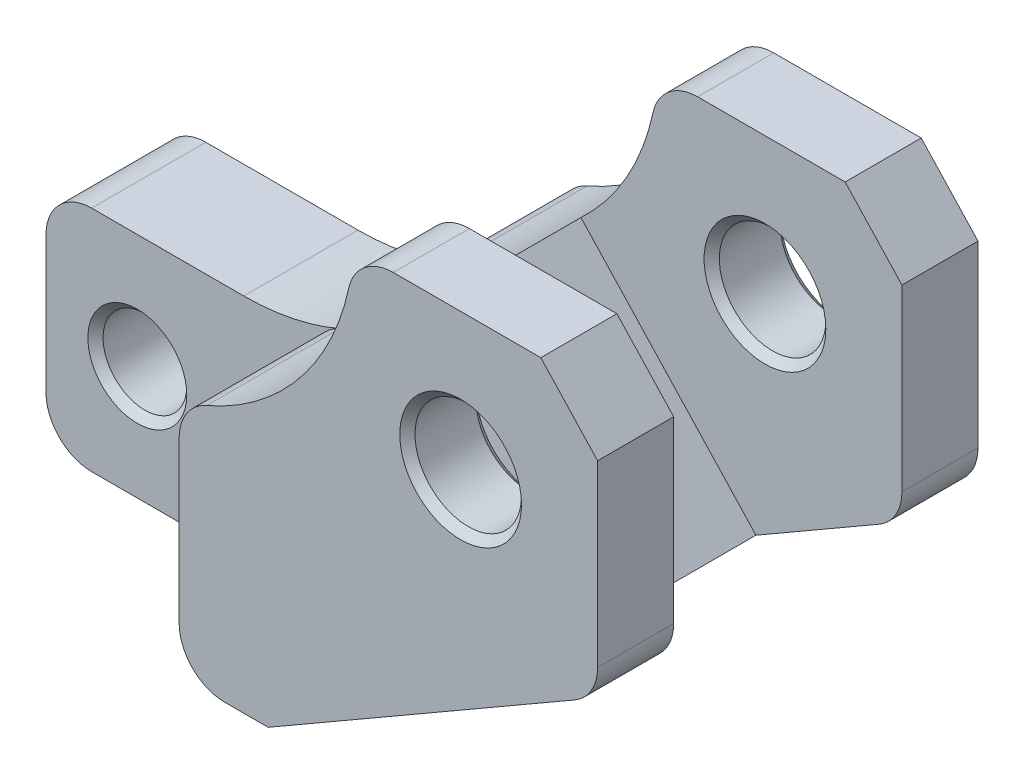
ISO-10303-21;
HEADER;
FILE_DESCRIPTION(('STEP AP214'),'2;1');
FILE_NAME('part.step','',(''),(''),'','','');
FILE_SCHEMA(('AUTOMOTIVE_DESIGN { 1 0 10303 214 1 1 1 1 }'));
ENDSEC;
DATA;
#1=APPLICATION_CONTEXT('core data for automotive mechanical design processes');
#2=APPLICATION_PROTOCOL_DEFINITION('international standard','automotive_design',2000,#1);
#3=PRODUCT_CONTEXT('',#1,'mechanical');
#4=PRODUCT('Part','Part','',(#3));
#5=PRODUCT_RELATED_PRODUCT_CATEGORY('part','',(#4));
#6=PRODUCT_DEFINITION_FORMATION('','',#4);
#7=PRODUCT_DEFINITION_CONTEXT('part definition',#1,'design');
#8=PRODUCT_DEFINITION('design','',#6,#7);
#9=PRODUCT_DEFINITION_SHAPE('','',#8);
#10=(LENGTH_UNIT() NAMED_UNIT(*) SI_UNIT(.MILLI.,.METRE.));
#11=(NAMED_UNIT(*) PLANE_ANGLE_UNIT() SI_UNIT($,.RADIAN.));
#12=(NAMED_UNIT(*) SI_UNIT($,.STERADIAN.) SOLID_ANGLE_UNIT());
#13=UNCERTAINTY_MEASURE_WITH_UNIT(LENGTH_MEASURE(1.E-05),#10,'distance_accuracy_value','');
#14=(GEOMETRIC_REPRESENTATION_CONTEXT(3) GLOBAL_UNCERTAINTY_ASSIGNED_CONTEXT((#13)) GLOBAL_UNIT_ASSIGNED_CONTEXT((#10,
#11,#12)) REPRESENTATION_CONTEXT('',''));
#15=CARTESIAN_POINT('',(0.,0.,0.));
#16=DIRECTION('',(0.,0.,1.));
#17=DIRECTION('',(1.,0.,0.));
#18=AXIS2_PLACEMENT_3D('',#15,#16,#17);
#19=CARTESIAN_POINT('',(6000.00000000004,30000.,25000.));
#20=DIRECTION('',(0.,-1.,0.));
#21=DIRECTION('',(0.,0.,-1.));
#22=AXIS2_PLACEMENT_3D('',#19,#20,#21);
#23=PLANE('',#22);
#24=DIRECTION('',(-1.,0.,0.));
#25=VECTOR('',#24,1.);
#26=CARTESIAN_POINT('',(26000.,30000.,-7500.));
#27=LINE('',#26,#25);
#28=CARTESIAN_POINT('',(26000.,30000.,-7500.));
#29=VERTEX_POINT('',#28);
#30=CARTESIAN_POINT('',(6000.00000000004,30000.,-7500.));
#31=VERTEX_POINT('',#30);
#32=EDGE_CURVE('E875',#29,#31,#27,.T.);
#33=ORIENTED_EDGE('',*,*,#32,.T.);
#34=DIRECTION('',(0.,0.,-1.));
#35=VECTOR('',#34,1.);
#36=CARTESIAN_POINT('',(6000.00000000004,30000.,25000.));
#37=LINE('',#36,#35);
#38=CARTESIAN_POINT('',(6000.00000000004,30000.,7500.));
#39=VERTEX_POINT('',#38);
#40=EDGE_CURVE('E251',#39,#31,#37,.T.);
#41=ORIENTED_EDGE('',*,*,#40,.F.);
#42=DIRECTION('',(-1.,0.,0.));
#43=VECTOR('',#42,1.);
#44=CARTESIAN_POINT('',(26000.,30000.,7500.));
#45=LINE('',#44,#43);
#46=CARTESIAN_POINT('',(26000.,30000.,7500.));
#47=VERTEX_POINT('',#46);
#48=EDGE_CURVE('E381',#47,#39,#45,.T.);
#49=ORIENTED_EDGE('',*,*,#48,.F.);
#50=DIRECTION('',(0.,0.,-1.));
#51=VECTOR('',#50,1.);
#52=CARTESIAN_POINT('',(26000.,30000.,25000.));
#53=LINE('',#52,#51);
#54=EDGE_CURVE('E254',#47,#29,#53,.T.);
#55=ORIENTED_EDGE('',*,*,#54,.T.);
#56=EDGE_LOOP('',(#33,#41,#49,#55));
#57=FACE_BOUND('',#56,.T.);
#58=ADVANCED_FACE('F33',(#57),#23,.F.);
#59=CARTESIAN_POINT('',(6000.,24000.,25000.));
#60=DIRECTION('',(0.,0.,-1.));
#61=DIRECTION('',(-1.,0.,0.));
#62=AXIS2_PLACEMENT_3D('',#59,#60,#61);
#63=CYLINDRICAL_SURFACE('',#62,6000.);
#64=CARTESIAN_POINT('',(6000.,24000.,-7500.));
#65=DIRECTION('',(0.,0.,1.));
#66=DIRECTION('',(1.,0.,0.));
#67=AXIS2_PLACEMENT_3D('',#64,#65,#66);
#68=CIRCLE('',#67,6000.);
#69=CARTESIAN_POINT('',(-1.77635683940025E-12,24000.,-7500.));
#70=VERTEX_POINT('',#69);
#71=EDGE_CURVE('E878',#31,#70,#68,.T.);
#72=ORIENTED_EDGE('',*,*,#71,.T.);
#73=DIRECTION('',(0.,0.,-1.));
#74=VECTOR('',#73,1.);
#75=CARTESIAN_POINT('',(-6.75986067126203E-13,24000.,25000.));
#76=LINE('',#75,#74);
#77=CARTESIAN_POINT('',(-1.77635683940025E-12,24000.,7500.));
#78=VERTEX_POINT('',#77);
#79=EDGE_CURVE('E242',#78,#70,#76,.T.);
#80=ORIENTED_EDGE('',*,*,#79,.F.);
#81=CARTESIAN_POINT('',(6000.,24000.,7500.));
#82=DIRECTION('',(0.,0.,1.));
#83=DIRECTION('',(1.,0.,0.));
#84=AXIS2_PLACEMENT_3D('',#81,#82,#83);
#85=CIRCLE('',#84,6000.);
#86=EDGE_CURVE('E383',#39,#78,#85,.T.);
#87=ORIENTED_EDGE('',*,*,#86,.F.);
#88=ORIENTED_EDGE('',*,*,#40,.T.);
#89=EDGE_LOOP('',(#72,#80,#87,#88));
#90=FACE_BOUND('',#89,.T.);
#91=ADVANCED_FACE('F534',(#90),#63,.T.);
#92=CARTESIAN_POINT('',(-6.75986067126203E-13,24000.,25000.));
#93=DIRECTION('',(1.,0.,0.));
#94=DIRECTION('',(0.,1.,0.));
#95=AXIS2_PLACEMENT_3D('',#92,#93,#94);
#96=PLANE('',#95);
#97=DIRECTION('',(0.,-1.,0.));
#98=VECTOR('',#97,1.);
#99=CARTESIAN_POINT('',(-1.77635683940025E-12,24000.,-7500.));
#100=LINE('',#99,#98);
#101=CARTESIAN_POINT('',(0.,6000.00000000004,-7500.));
#102=VERTEX_POINT('',#101);
#103=EDGE_CURVE('E234',#70,#102,#100,.T.);
#104=ORIENTED_EDGE('',*,*,#103,.T.);
#105=DIRECTION('',(0.,0.,-1.));
#106=VECTOR('',#105,1.);
#107=CARTESIAN_POINT('',(0.,6000.00000000004,25000.));
#108=LINE('',#107,#106);
#109=CARTESIAN_POINT('',(0.,6000.00000000004,7500.));
#110=VERTEX_POINT('',#109);
#111=EDGE_CURVE('E233',#110,#102,#108,.T.);
#112=ORIENTED_EDGE('',*,*,#111,.F.);
#113=DIRECTION('',(0.,-1.,0.));
#114=VECTOR('',#113,1.);
#115=CARTESIAN_POINT('',(-1.77635683940025E-12,24000.,7500.));
#116=LINE('',#115,#114);
#117=EDGE_CURVE('E385',#78,#110,#116,.T.);
#118=ORIENTED_EDGE('',*,*,#117,.F.);
#119=ORIENTED_EDGE('',*,*,#79,.T.);
#120=EDGE_LOOP('',(#104,#112,#118,#119));
#121=FACE_BOUND('',#120,.T.);
#122=ADVANCED_FACE('F540',(#121),#96,.F.);
#123=CARTESIAN_POINT('',(6000.,6000.,25000.));
#124=DIRECTION('',(0.,0.,-1.));
#125=DIRECTION('',(-1.,0.,0.));
#126=AXIS2_PLACEMENT_3D('',#123,#124,#125);
#127=CYLINDRICAL_SURFACE('',#126,6000.);
#128=CARTESIAN_POINT('',(6000.,6000.,-7500.));
#129=DIRECTION('',(0.,0.,1.));
#130=DIRECTION('',(1.,0.,0.));
#131=AXIS2_PLACEMENT_3D('',#128,#129,#130);
#132=CIRCLE('',#131,6000.);
#133=CARTESIAN_POINT('',(6000.00000000004,0.,-7500.));
#134=VERTEX_POINT('',#133);
#135=EDGE_CURVE('E217',#102,#134,#132,.T.);
#136=ORIENTED_EDGE('',*,*,#135,.T.);
#137=DIRECTION('',(0.,0.,-1.));
#138=VECTOR('',#137,1.);
#139=CARTESIAN_POINT('',(6000.00000000004,0.,25000.));
#140=LINE('',#139,#138);
#141=CARTESIAN_POINT('',(6000.00000000004,0.,7500.));
#142=VERTEX_POINT('',#141);
#143=EDGE_CURVE('E231',#142,#134,#140,.T.);
#144=ORIENTED_EDGE('',*,*,#143,.F.);
#145=CARTESIAN_POINT('',(6000.,6000.,7500.));
#146=DIRECTION('',(0.,0.,1.));
#147=DIRECTION('',(1.,0.,0.));
#148=AXIS2_PLACEMENT_3D('',#145,#146,#147);
#149=CIRCLE('',#148,6000.);
#150=EDGE_CURVE('E387',#110,#142,#149,.T.);
#151=ORIENTED_EDGE('',*,*,#150,.F.);
#152=ORIENTED_EDGE('',*,*,#111,.T.);
#153=EDGE_LOOP('',(#136,#144,#151,#152));
#154=FACE_BOUND('',#153,.T.);
#155=ADVANCED_FACE('F229',(#154),#127,.T.);
#156=CARTESIAN_POINT('',(26000.,62000.,25000.));
#157=DIRECTION('',(0.,0.,-1.));
#158=DIRECTION('',(-1.,0.,0.));
#159=AXIS2_PLACEMENT_3D('',#156,#157,#158);
#160=CYLINDRICAL_SURFACE('',#159,32000.);
#161=CARTESIAN_POINT('',(26000.,62000.,-25000.));
#162=DIRECTION('',(0.,0.,-1.));
#163=DIRECTION('',(1.,0.,0.));
#164=AXIS2_PLACEMENT_3D('',#161,#162,#163);
#165=CIRCLE('',#164,32000.);
#166=CARTESIAN_POINT('',(57282.8220985376,55263.1578947368,-25000.));
#167=VERTEX_POINT('',#166);
#168=CARTESIAN_POINT('',(38631.5789473684,32598.5848419434,-25000.));
#169=VERTEX_POINT('',#168);
#170=EDGE_CURVE('E358',#167,#169,#165,.T.);
#171=ORIENTED_EDGE('',*,*,#170,.T.);
#172=DIRECTION('',(0.,0.,-1.));
#173=VECTOR('',#172,1.);
#174=CARTESIAN_POINT('',(38631.5789473684,32598.5848419434,25000.));
#175=LINE('',#174,#173);
#176=CARTESIAN_POINT('',(38631.5789473684,32598.5848419434,-7500.));
#177=VERTEX_POINT('',#176);
#178=EDGE_CURVE('E351',#169,#177,#175,.F.);
#179=ORIENTED_EDGE('',*,*,#178,.T.);
#180=CARTESIAN_POINT('',(26000.,62000.,-7500.));
#181=DIRECTION('',(0.,0.,-1.));
#182=DIRECTION('',(1.,0.,0.));
#183=AXIS2_PLACEMENT_3D('',#180,#181,#182);
#184=CIRCLE('',#183,32000.);
#185=EDGE_CURVE('E47',#177,#29,#184,.T.);
#186=ORIENTED_EDGE('',*,*,#185,.T.);
#187=ORIENTED_EDGE('',*,*,#54,.F.);
#188=CARTESIAN_POINT('',(26000.,62000.,7500.));
#189=DIRECTION('',(0.,0.,-1.));
#190=DIRECTION('',(1.,0.,0.));
#191=AXIS2_PLACEMENT_3D('',#188,#189,#190);
#192=CIRCLE('',#191,32000.);
#193=CARTESIAN_POINT('',(38631.5789473684,32598.5848419434,7500.));
#194=VERTEX_POINT('',#193);
#195=EDGE_CURVE('E379',#194,#47,#192,.T.);
#196=ORIENTED_EDGE('',*,*,#195,.F.);
#197=DIRECTION('',(0.,0.,-1.));
#198=VECTOR('',#197,1.);
#199=CARTESIAN_POINT('',(38631.5789473684,32598.5848419434,25000.));
#200=LINE('',#199,#198);
#201=CARTESIAN_POINT('',(38631.5789473684,32598.5848419434,25000.));
#202=VERTEX_POINT('',#201);
#203=EDGE_CURVE('E296',#194,#202,#200,.F.);
#204=ORIENTED_EDGE('',*,*,#203,.T.);
#205=CARTESIAN_POINT('',(26000.,62000.,25000.));
#206=DIRECTION('',(0.,0.,-1.));
#207=DIRECTION('',(1.,0.,0.));
#208=AXIS2_PLACEMENT_3D('',#205,#206,#207);
#209=CIRCLE('',#208,32000.);
#210=CARTESIAN_POINT('',(57282.8220985376,55263.1578947368,25000.));
#211=VERTEX_POINT('',#210);
#212=EDGE_CURVE('E451',#211,#202,#209,.T.);
#213=ORIENTED_EDGE('',*,*,#212,.F.);
#214=DIRECTION('',(0.,0.,-1.));
#215=VECTOR('',#214,1.);
#216=CARTESIAN_POINT('',(57282.8220985376,55263.1578947368,25000.));
#217=LINE('',#216,#215);
#218=CARTESIAN_POINT('',(57282.8220985376,55263.1578947368,15000.));
#219=VERTEX_POINT('',#218);
#220=EDGE_CURVE('E258',#211,#219,#217,.T.);
#221=ORIENTED_EDGE('',*,*,#220,.T.);
#222=CARTESIAN_POINT('',(26000.,62000.,15000.));
#223=DIRECTION('',(0.,0.,-1.));
#224=DIRECTION('',(1.,0.,0.));
#225=AXIS2_PLACEMENT_3D('',#222,#223,#224);
#226=CIRCLE('',#225,32000.);
#227=CARTESIAN_POINT('',(47814.1844675067,38587.5811583341,15000.));
#228=VERTEX_POINT('',#227);
#229=EDGE_CURVE('E428',#219,#228,#226,.T.);
#230=ORIENTED_EDGE('',*,*,#229,.T.);
#231=DIRECTION('',(0.,0.,1.));
#232=VECTOR('',#231,1.);
#233=CARTESIAN_POINT('',(47814.1844675067,38587.5811583341,-15000.));
#234=LINE('',#233,#232);
#235=CARTESIAN_POINT('',(47814.1844675067,38587.5811583341,-15000.));
#236=VERTEX_POINT('',#235);
#237=EDGE_CURVE('E410',#236,#228,#234,.T.);
#238=ORIENTED_EDGE('',*,*,#237,.F.);
#239=CARTESIAN_POINT('',(26000.,62000.,-15000.));
#240=DIRECTION('',(0.,0.,-1.));
#241=DIRECTION('',(1.,0.,0.));
#242=AXIS2_PLACEMENT_3D('',#239,#240,#241);
#243=CIRCLE('',#242,32000.);
#244=CARTESIAN_POINT('',(57282.8220985376,55263.1578947368,-15000.));
#245=VERTEX_POINT('',#244);
#246=EDGE_CURVE('E405',#245,#236,#243,.T.);
#247=ORIENTED_EDGE('',*,*,#246,.F.);
#248=EDGE_CURVE('E257',#245,#167,#217,.T.);
#249=ORIENTED_EDGE('',*,*,#248,.T.);
#250=EDGE_LOOP('',(#171,#179,#186,#187,#196,#204,#213,#221,#230,#238,#247,#249));
#251=FACE_BOUND('',#250,.T.);
#252=ADVANCED_FACE('F355',(#251),#160,.F.);
#253=CARTESIAN_POINT('',(6000.00000000004,0.,25000.));
#254=DIRECTION('',(0.,1.,0.));
#255=DIRECTION('',(0.,0.,1.));
#256=AXIS2_PLACEMENT_3D('',#253,#254,#255);
#257=PLANE('',#256);
#258=DIRECTION('',(1.,0.,0.));
#259=VECTOR('',#258,1.);
#260=CARTESIAN_POINT('',(6000.00000000004,0.,-7500.));
#261=LINE('',#260,#259);
#262=CARTESIAN_POINT('',(41000.,0.,-7500.));
#263=VERTEX_POINT('',#262);
#264=EDGE_CURVE('E214',#134,#263,#261,.T.);
#265=ORIENTED_EDGE('',*,*,#264,.T.);
#266=DIRECTION('',(0.,0.,-1.));
#267=VECTOR('',#266,1.);
#268=CARTESIAN_POINT('',(41000.,0.,-25000.));
#269=LINE('',#268,#267);
#270=CARTESIAN_POINT('',(41000.,0.,-25000.));
#271=VERTEX_POINT('',#270);
#272=EDGE_CURVE('E340',#263,#271,#269,.T.);
#273=ORIENTED_EDGE('',*,*,#272,.T.);
#274=DIRECTION('',(1.,0.,0.));
#275=VECTOR('',#274,1.);
#276=CARTESIAN_POINT('',(6000.00000000004,0.,-25000.));
#277=LINE('',#276,#275);
#278=CARTESIAN_POINT('',(46698.7298107782,0.,-25000.));
#279=VERTEX_POINT('',#278);
#280=EDGE_CURVE('E442',#271,#279,#277,.T.);
#281=ORIENTED_EDGE('',*,*,#280,.T.);
#282=DIRECTION('',(0.,0.,-1.));
#283=VECTOR('',#282,1.);
#284=CARTESIAN_POINT('',(46698.7298107782,0.,25000.));
#285=LINE('',#284,#283);
#286=CARTESIAN_POINT('',(46698.7298107782,0.,25000.));
#287=VERTEX_POINT('',#286);
#288=EDGE_CURVE('E240',#287,#279,#285,.T.);
#289=ORIENTED_EDGE('',*,*,#288,.F.);
#290=DIRECTION('',(1.,0.,0.));
#291=VECTOR('',#290,1.);
#292=CARTESIAN_POINT('',(6000.00000000004,0.,25000.));
#293=LINE('',#292,#291);
#294=CARTESIAN_POINT('',(41000.,0.,25000.));
#295=VERTEX_POINT('',#294);
#296=EDGE_CURVE('E245',#295,#287,#293,.T.);
#297=ORIENTED_EDGE('',*,*,#296,.F.);
#298=DIRECTION('',(0.,0.,1.));
#299=VECTOR('',#298,1.);
#300=CARTESIAN_POINT('',(41000.,0.,25000.));
#301=LINE('',#300,#299);
#302=CARTESIAN_POINT('',(41000.,0.,7500.));
#303=VERTEX_POINT('',#302);
#304=EDGE_CURVE('E294',#295,#303,#301,.F.);
#305=ORIENTED_EDGE('',*,*,#304,.T.);
#306=DIRECTION('',(1.,0.,0.));
#307=VECTOR('',#306,1.);
#308=CARTESIAN_POINT('',(6000.00000000004,0.,7500.));
#309=LINE('',#308,#307);
#310=EDGE_CURVE('E239',#142,#303,#309,.T.);
#311=ORIENTED_EDGE('',*,*,#310,.F.);
#312=ORIENTED_EDGE('',*,*,#143,.T.);
#313=EDGE_LOOP('',(#265,#273,#281,#289,#297,#305,#311,#312));
#314=FACE_BOUND('',#313,.T.);
#315=ADVANCED_FACE('F237',(#314),#257,.F.);
#316=CARTESIAN_POINT('',(46698.7298107782,0.,25000.));
#317=DIRECTION('',(-0.500000000000001,0.866025403784438,0.));
#318=DIRECTION('',(-0.866025403784438,-0.500000000000001,0.));
#319=AXIS2_PLACEMENT_3D('',#316,#317,#318);
#320=PLANE('',#319);
#321=DIRECTION('',(0.866025403784438,0.500000000000001,0.));
#322=VECTOR('',#321,1.);
#323=CARTESIAN_POINT('',(70814.2066470866,13923.0770430789,-15000.));
#324=LINE('',#323,#322);
#325=CARTESIAN_POINT('',(70814.2066470866,13923.0770430789,-15000.));
#326=VERTEX_POINT('',#325);
#327=CARTESIAN_POINT('',(87000.,23267.9491924311,-15000.));
#328=VERTEX_POINT('',#327);
#329=EDGE_CURVE('E392',#326,#328,#324,.T.);
#330=ORIENTED_EDGE('',*,*,#329,.F.);
#331=DIRECTION('',(0.,0.,1.));
#332=VECTOR('',#331,1.);
#333=CARTESIAN_POINT('',(70814.2066470866,13923.0770430789,-15000.));
#334=LINE('',#333,#332);
#335=CARTESIAN_POINT('',(70814.2066470866,13923.0770430789,15000.));
#336=VERTEX_POINT('',#335);
#337=EDGE_CURVE('E433',#326,#336,#334,.T.);
#338=ORIENTED_EDGE('',*,*,#337,.T.);
#339=DIRECTION('',(0.866025403784438,0.500000000000001,0.));
#340=VECTOR('',#339,1.);
#341=CARTESIAN_POINT('',(70814.2066470866,13923.0770430789,15000.));
#342=LINE('',#341,#340);
#343=CARTESIAN_POINT('',(87000.,23267.9491924311,15000.));
#344=VERTEX_POINT('',#343);
#345=EDGE_CURVE('E389',#336,#344,#342,.T.);
#346=ORIENTED_EDGE('',*,*,#345,.T.);
#347=DIRECTION('',(0.,0.,-1.));
#348=VECTOR('',#347,1.);
#349=CARTESIAN_POINT('',(87000.,23267.9491924311,25000.));
#350=LINE('',#349,#348);
#351=CARTESIAN_POINT('',(87000.,23267.9491924311,25000.));
#352=VERTEX_POINT('',#351);
#353=EDGE_CURVE('E270',#352,#344,#350,.T.);
#354=ORIENTED_EDGE('',*,*,#353,.F.);
#355=DIRECTION('',(0.866025403784438,0.500000000000001,0.));
#356=VECTOR('',#355,1.);
#357=CARTESIAN_POINT('',(46698.7298107782,0.,25000.));
#358=LINE('',#357,#356);
#359=EDGE_CURVE('E438',#287,#352,#358,.T.);
#360=ORIENTED_EDGE('',*,*,#359,.F.);
#361=ORIENTED_EDGE('',*,*,#288,.T.);
#362=DIRECTION('',(0.866025403784438,0.500000000000001,0.));
#363=VECTOR('',#362,1.);
#364=CARTESIAN_POINT('',(46698.7298107782,0.,-25000.));
#365=LINE('',#364,#363);
#366=CARTESIAN_POINT('',(87000.,23267.9491924311,-25000.));
#367=VERTEX_POINT('',#366);
#368=EDGE_CURVE('E436',#279,#367,#365,.T.);
#369=ORIENTED_EDGE('',*,*,#368,.T.);
#370=EDGE_CURVE('E269',#328,#367,#350,.T.);
#371=ORIENTED_EDGE('',*,*,#370,.F.);
#372=EDGE_LOOP('',(#330,#338,#346,#354,#360,#361,#369,#371));
#373=FACE_BOUND('',#372,.T.);
#374=ADVANCED_FACE('F475',(#373),#320,.F.);
#375=CARTESIAN_POINT('',(84000.,28464.1016151378,25000.));
#376=DIRECTION('',(0.,0.,-1.));
#377=DIRECTION('',(-1.,0.,0.));
#378=AXIS2_PLACEMENT_3D('',#375,#376,#377);
#379=CYLINDRICAL_SURFACE('',#378,6000.);
#380=CARTESIAN_POINT('',(84000.,28464.1016151378,-15000.));
#381=DIRECTION('',(0.,0.,1.));
#382=DIRECTION('',(1.,0.,0.));
#383=AXIS2_PLACEMENT_3D('',#380,#381,#382);
#384=CIRCLE('',#383,6000.);
#385=CARTESIAN_POINT('',(90000.,28464.1016151378,-15000.));
#386=VERTEX_POINT('',#385);
#387=EDGE_CURVE('E394',#328,#386,#384,.T.);
#388=ORIENTED_EDGE('',*,*,#387,.F.);
#389=ORIENTED_EDGE('',*,*,#370,.T.);
#390=CARTESIAN_POINT('',(84000.,28464.1016151378,-25000.));
#391=DIRECTION('',(0.,0.,1.));
#392=DIRECTION('',(1.,0.,0.));
#393=AXIS2_PLACEMENT_3D('',#390,#391,#392);
#394=CIRCLE('',#393,6000.);
#395=CARTESIAN_POINT('',(90000.,28464.1016151378,-25000.));
#396=VERTEX_POINT('',#395);
#397=EDGE_CURVE('E457',#367,#396,#394,.T.);
#398=ORIENTED_EDGE('',*,*,#397,.T.);
#399=DIRECTION('',(0.,0.,-1.));
#400=VECTOR('',#399,1.);
#401=CARTESIAN_POINT('',(90000.,28464.1016151378,25000.));
#402=LINE('',#401,#400);
#403=EDGE_CURVE('E265',#386,#396,#402,.T.);
#404=ORIENTED_EDGE('',*,*,#403,.F.);
#405=EDGE_LOOP('',(#388,#389,#398,#404));
#406=FACE_BOUND('',#405,.T.);
#407=ADVANCED_FACE('F483',(#406),#379,.T.);
#408=CARTESIAN_POINT('',(90000.,28464.1016151378,25000.));
#409=DIRECTION('',(-1.,0.,0.));
#410=DIRECTION('',(0.,0.,1.));
#411=AXIS2_PLACEMENT_3D('',#408,#409,#410);
#412=PLANE('',#411);
#413=DIRECTION('',(0.,1.,0.));
#414=VECTOR('',#413,1.);
#415=CARTESIAN_POINT('',(90000.,28464.1016151378,-15000.));
#416=LINE('',#415,#414);
#417=CARTESIAN_POINT('',(90000.,52000.,-15000.));
#418=VERTEX_POINT('',#417);
#419=EDGE_CURVE('E397',#386,#418,#416,.T.);
#420=ORIENTED_EDGE('',*,*,#419,.F.);
#421=ORIENTED_EDGE('',*,*,#403,.T.);
#422=DIRECTION('',(0.,1.,0.));
#423=VECTOR('',#422,1.);
#424=CARTESIAN_POINT('',(90000.,28464.1016151378,-25000.));
#425=LINE('',#424,#423);
#426=CARTESIAN_POINT('',(90000.,52000.,-25000.));
#427=VERTEX_POINT('',#426);
#428=EDGE_CURVE('E460',#396,#427,#425,.T.);
#429=ORIENTED_EDGE('',*,*,#428,.T.);
#430=DIRECTION('',(0.,0.,1.));
#431=VECTOR('',#430,1.);
#432=CARTESIAN_POINT('',(90000.,52000.,25000.));
#433=LINE('',#432,#431);
#434=EDGE_CURVE('E280',#427,#418,#433,.T.);
#435=ORIENTED_EDGE('',*,*,#434,.T.);
#436=EDGE_LOOP('',(#420,#421,#429,#435));
#437=FACE_BOUND('',#436,.T.);
#438=ADVANCED_FACE('F527',(#437),#412,.F.);
#439=CARTESIAN_POINT('',(90000.,60000.,25000.));
#440=DIRECTION('',(0.,-1.,0.));
#441=DIRECTION('',(1.,0.,0.));
#442=AXIS2_PLACEMENT_3D('',#439,#440,#441);
#443=PLANE('',#442);
#444=DIRECTION('',(-1.,0.,0.));
#445=VECTOR('',#444,1.);
#446=CARTESIAN_POINT('',(82539.8793108987,60000.,-15000.));
#447=LINE('',#446,#445);
#448=CARTESIAN_POINT('',(82539.8793108987,60000.,-15000.));
#449=VERTEX_POINT('',#448);
#450=CARTESIAN_POINT('',(63148.3512420134,60000.,-15000.));
#451=VERTEX_POINT('',#450);
#452=EDGE_CURVE('E401',#449,#451,#447,.T.);
#453=ORIENTED_EDGE('',*,*,#452,.F.);
#454=DIRECTION('',(0.,0.,-1.));
#455=VECTOR('',#454,1.);
#456=CARTESIAN_POINT('',(82539.8793108987,60000.,25000.));
#457=LINE('',#456,#455);
#458=CARTESIAN_POINT('',(82539.8793108987,60000.,-25000.));
#459=VERTEX_POINT('',#458);
#460=EDGE_CURVE('E273',#449,#459,#457,.T.);
#461=ORIENTED_EDGE('',*,*,#460,.T.);
#462=DIRECTION('',(-1.,0.,0.));
#463=VECTOR('',#462,1.);
#464=CARTESIAN_POINT('',(90000.,60000.,-25000.));
#465=LINE('',#464,#463);
#466=CARTESIAN_POINT('',(63148.3512420134,60000.,-25000.));
#467=VERTEX_POINT('',#466);
#468=EDGE_CURVE('E463',#459,#467,#465,.T.);
#469=ORIENTED_EDGE('',*,*,#468,.T.);
#470=DIRECTION('',(0.,0.,-1.));
#471=VECTOR('',#470,1.);
#472=CARTESIAN_POINT('',(63148.3512420134,60000.,25000.));
#473=LINE('',#472,#471);
#474=EDGE_CURVE('E261',#451,#467,#473,.T.);
#475=ORIENTED_EDGE('',*,*,#474,.F.);
#476=EDGE_LOOP('',(#453,#461,#469,#475));
#477=FACE_BOUND('',#476,.T.);
#478=ADVANCED_FACE('F551',(#477),#443,.F.);
#479=CARTESIAN_POINT('',(63148.3512420134,54000.,25000.));
#480=DIRECTION('',(0.,0.,-1.));
#481=DIRECTION('',(-1.,0.,0.));
#482=AXIS2_PLACEMENT_3D('',#479,#480,#481);
#483=CYLINDRICAL_SURFACE('',#482,6000.);
#484=CARTESIAN_POINT('',(63148.3512420134,54000.,-15000.));
#485=DIRECTION('',(0.,0.,1.));
#486=DIRECTION('',(1.,0.,0.));
#487=AXIS2_PLACEMENT_3D('',#484,#485,#486);
#488=CIRCLE('',#487,6000.00000000001);
#489=EDGE_CURVE('E403',#451,#245,#488,.T.);
#490=ORIENTED_EDGE('',*,*,#489,.F.);
#491=ORIENTED_EDGE('',*,*,#474,.T.);
#492=CARTESIAN_POINT('',(63148.3512420134,54000.,-25000.));
#493=DIRECTION('',(0.,0.,1.));
#494=DIRECTION('',(1.,0.,0.));
#495=AXIS2_PLACEMENT_3D('',#492,#493,#494);
#496=CIRCLE('',#495,6000.);
#497=EDGE_CURVE('E466',#467,#167,#496,.T.);
#498=ORIENTED_EDGE('',*,*,#497,.T.);
#499=ORIENTED_EDGE('',*,*,#248,.F.);
#500=EDGE_LOOP('',(#490,#491,#498,#499));
#501=FACE_BOUND('',#500,.T.);
#502=ADVANCED_FACE('F528',(#501),#483,.T.);
#503=CARTESIAN_POINT('',(82539.8793108987,60000.,25000.));
#504=DIRECTION('',(-0.731353701619172,-0.681998360062497,0.));
#505=DIRECTION('',(0.,0.,-1.));
#506=AXIS2_PLACEMENT_3D('',#503,#504,#505);
#507=PLANE('',#506);
#508=ORIENTED_EDGE('',*,*,#460,.F.);
#509=DIRECTION('',(-0.681998360062497,0.731353701619172,0.));
#510=VECTOR('',#509,1.);
#511=CARTESIAN_POINT('',(90000.,52000.,-15000.));
#512=LINE('',#511,#510);
#513=EDGE_CURVE('E399',#418,#449,#512,.T.);
#514=ORIENTED_EDGE('',*,*,#513,.F.);
#515=ORIENTED_EDGE('',*,*,#434,.F.);
#516=DIRECTION('',(-0.681998360062497,0.731353701619172,0.));
#517=VECTOR('',#516,1.);
#518=CARTESIAN_POINT('',(82539.8793108987,60000.,-25000.));
#519=LINE('',#518,#517);
#520=EDGE_CURVE('E277',#459,#427,#519,.F.);
#521=ORIENTED_EDGE('',*,*,#520,.F.);
#522=EDGE_LOOP('',(#508,#514,#515,#521));
#523=FACE_BOUND('',#522,.T.);
#524=ADVANCED_FACE('F520',(#523),#507,.F.);
#525=ORIENTED_EDGE('',*,*,#353,.T.);
#526=CARTESIAN_POINT('',(84000.,28464.1016151378,15000.));
#527=DIRECTION('',(0.,0.,1.));
#528=DIRECTION('',(1.,0.,0.));
#529=AXIS2_PLACEMENT_3D('',#526,#527,#528);
#530=CIRCLE('',#529,6000.);
#531=CARTESIAN_POINT('',(90000.,28464.1016151378,15000.));
#532=VERTEX_POINT('',#531);
#533=EDGE_CURVE('E413',#344,#532,#530,.T.);
#534=ORIENTED_EDGE('',*,*,#533,.T.);
#535=CARTESIAN_POINT('',(90000.,28464.1016151378,25000.));
#536=VERTEX_POINT('',#535);
#537=EDGE_CURVE('E266',#536,#532,#402,.T.);
#538=ORIENTED_EDGE('',*,*,#537,.F.);
#539=CARTESIAN_POINT('',(84000.,28464.1016151378,25000.));
#540=DIRECTION('',(0.,0.,1.));
#541=DIRECTION('',(1.,0.,0.));
#542=AXIS2_PLACEMENT_3D('',#539,#540,#541);
#543=CIRCLE('',#542,6000.);
#544=EDGE_CURVE('E441',#352,#536,#543,.T.);
#545=ORIENTED_EDGE('',*,*,#544,.F.);
#546=EDGE_LOOP('',(#525,#534,#538,#545));
#547=FACE_BOUND('',#546,.T.);
#548=ADVANCED_FACE('F518',(#547),#379,.T.);
#549=ORIENTED_EDGE('',*,*,#537,.T.);
#550=DIRECTION('',(0.,1.,0.));
#551=VECTOR('',#550,1.);
#552=CARTESIAN_POINT('',(90000.,28464.1016151378,15000.));
#553=LINE('',#552,#551);
#554=CARTESIAN_POINT('',(90000.,52000.,15000.));
#555=VERTEX_POINT('',#554);
#556=EDGE_CURVE('E416',#532,#555,#553,.T.);
#557=ORIENTED_EDGE('',*,*,#556,.T.);
#558=CARTESIAN_POINT('',(90000.,52000.,25000.));
#559=VERTEX_POINT('',#558);
#560=EDGE_CURVE('E279',#555,#559,#433,.T.);
#561=ORIENTED_EDGE('',*,*,#560,.T.);
#562=DIRECTION('',(0.,1.,0.));
#563=VECTOR('',#562,1.);
#564=CARTESIAN_POINT('',(90000.,28464.1016151378,25000.));
#565=LINE('',#564,#563);
#566=EDGE_CURVE('E444',#536,#559,#565,.T.);
#567=ORIENTED_EDGE('',*,*,#566,.F.);
#568=EDGE_LOOP('',(#549,#557,#561,#567));
#569=FACE_BOUND('',#568,.T.);
#570=ADVANCED_FACE('F512',(#569),#412,.F.);
#571=CARTESIAN_POINT('',(82539.8793108987,60000.,25000.));
#572=VERTEX_POINT('',#571);
#573=CARTESIAN_POINT('',(82539.8793108987,60000.,15000.));
#574=VERTEX_POINT('',#573);
#575=EDGE_CURVE('E274',#572,#574,#457,.T.);
#576=ORIENTED_EDGE('',*,*,#575,.T.);
#577=DIRECTION('',(-1.,0.,0.));
#578=VECTOR('',#577,1.);
#579=CARTESIAN_POINT('',(82539.8793108987,60000.,15000.));
#580=LINE('',#579,#578);
#581=CARTESIAN_POINT('',(63148.3512420134,60000.,15000.));
#582=VERTEX_POINT('',#581);
#583=EDGE_CURVE('E422',#574,#582,#580,.T.);
#584=ORIENTED_EDGE('',*,*,#583,.T.);
#585=CARTESIAN_POINT('',(63148.3512420134,60000.,25000.));
#586=VERTEX_POINT('',#585);
#587=EDGE_CURVE('E262',#586,#582,#473,.T.);
#588=ORIENTED_EDGE('',*,*,#587,.F.);
#589=DIRECTION('',(-1.,0.,0.));
#590=VECTOR('',#589,1.);
#591=CARTESIAN_POINT('',(90000.,60000.,25000.));
#592=LINE('',#591,#590);
#593=EDGE_CURVE('E447',#572,#586,#592,.T.);
#594=ORIENTED_EDGE('',*,*,#593,.F.);
#595=EDGE_LOOP('',(#576,#584,#588,#594));
#596=FACE_BOUND('',#595,.T.);
#597=ADVANCED_FACE('F504',(#596),#443,.F.);
#598=ORIENTED_EDGE('',*,*,#587,.T.);
#599=CARTESIAN_POINT('',(63148.3512420134,54000.,15000.));
#600=DIRECTION('',(0.,0.,1.));
#601=DIRECTION('',(1.,0.,0.));
#602=AXIS2_PLACEMENT_3D('',#599,#600,#601);
#603=CIRCLE('',#602,6000.00000000001);
#604=EDGE_CURVE('E425',#582,#219,#603,.T.);
#605=ORIENTED_EDGE('',*,*,#604,.T.);
#606=ORIENTED_EDGE('',*,*,#220,.F.);
#607=CARTESIAN_POINT('',(63148.3512420134,54000.,25000.));
#608=DIRECTION('',(0.,0.,1.));
#609=DIRECTION('',(1.,0.,0.));
#610=AXIS2_PLACEMENT_3D('',#607,#608,#609);
#611=CIRCLE('',#610,6000.);
#612=EDGE_CURVE('E449',#586,#211,#611,.T.);
#613=ORIENTED_EDGE('',*,*,#612,.F.);
#614=EDGE_LOOP('',(#598,#605,#606,#613));
#615=FACE_BOUND('',#614,.T.);
#616=ADVANCED_FACE('F499',(#615),#483,.T.);
#617=CARTESIAN_POINT('',(84000.,28464.1016151378,25000.));
#618=DIRECTION('',(0.,0.,1.));
#619=DIRECTION('',(1.,0.,0.));
#620=AXIS2_PLACEMENT_3D('',#617,#618,#619);
#621=PLANE('',#620);
#622=CARTESIAN_POINT('',(72000.,42000.,25000.));
#623=DIRECTION('',(0.,0.,1.));
#624=DIRECTION('',(1.,0.,0.));
#625=AXIS2_PLACEMENT_3D('',#622,#623,#624);
#626=CIRCLE('',#625,8000.00000000001);
#627=CARTESIAN_POINT('',(80000.,42000.,25000.));
#628=VERTEX_POINT('',#627);
#629=EDGE_CURVE('E310',#628,#628,#626,.F.);
#630=ORIENTED_EDGE('',*,*,#629,.T.);
#631=EDGE_LOOP('',(#630));
#632=FACE_BOUND('',#631,.T.);
#633=DIRECTION('',(0.,1.,0.));
#634=VECTOR('',#633,1.);
#635=CARTESIAN_POINT('',(35000.,0.,25000.));
#636=LINE('',#635,#634);
#637=CARTESIAN_POINT('',(35000.,6000.,25000.));
#638=VERTEX_POINT('',#637);
#639=CARTESIAN_POINT('',(35000.,27085.8194998078,25000.));
#640=VERTEX_POINT('',#639);
#641=EDGE_CURVE('E376',#638,#640,#636,.T.);
#642=ORIENTED_EDGE('',*,*,#641,.F.);
#643=CARTESIAN_POINT('',(41000.,6000.,25000.));
#644=DIRECTION('',(0.,0.,1.));
#645=DIRECTION('',(1.,0.,0.));
#646=AXIS2_PLACEMENT_3D('',#643,#644,#645);
#647=CIRCLE('',#646,6000.);
#648=EDGE_CURVE('E292',#638,#295,#647,.T.);
#649=ORIENTED_EDGE('',*,*,#648,.T.);
#650=ORIENTED_EDGE('',*,*,#296,.T.);
#651=ORIENTED_EDGE('',*,*,#359,.T.);
#652=ORIENTED_EDGE('',*,*,#544,.T.);
#653=ORIENTED_EDGE('',*,*,#566,.T.);
#654=DIRECTION('',(0.681998360062497,-0.731353701619172,0.));
#655=VECTOR('',#654,1.);
#656=CARTESIAN_POINT('',(98948.5524808858,42403.8523194843,25000.));
#657=LINE('',#656,#655);
#658=EDGE_CURVE('E283',#559,#572,#657,.F.);
#659=ORIENTED_EDGE('',*,*,#658,.T.);
#660=ORIENTED_EDGE('',*,*,#593,.T.);
#661=ORIENTED_EDGE('',*,*,#612,.T.);
#662=ORIENTED_EDGE('',*,*,#212,.T.);
#663=CARTESIAN_POINT('',(41000.,27085.8194998078,25000.));
#664=DIRECTION('',(0.,0.,1.));
#665=DIRECTION('',(1.,0.,0.));
#666=AXIS2_PLACEMENT_3D('',#663,#664,#665);
#667=CIRCLE('',#666,6000.);
#668=EDGE_CURVE('E290',#202,#640,#667,.T.);
#669=ORIENTED_EDGE('',*,*,#668,.T.);
#670=EDGE_LOOP('',(#642,#649,#650,#651,#652,#653,#659,#660,#661,#662,#669));
#671=FACE_BOUND('',#670,.T.);
#672=ADVANCED_FACE('F515',(#632,#671),#621,.T.);
#673=CARTESIAN_POINT('',(84000.,28464.1016151378,-25000.));
#674=DIRECTION('',(0.,0.,1.));
#675=DIRECTION('',(1.,0.,0.));
#676=AXIS2_PLACEMENT_3D('',#673,#674,#675);
#677=PLANE('',#676);
#678=CARTESIAN_POINT('',(72000.,42000.,-25000.));
#679=DIRECTION('',(0.,0.,1.));
#680=DIRECTION('',(1.,0.,0.));
#681=AXIS2_PLACEMENT_3D('',#678,#679,#680);
#682=CIRCLE('',#681,8000.00000000001);
#683=CARTESIAN_POINT('',(80000.,42000.,-25000.));
#684=VERTEX_POINT('',#683);
#685=EDGE_CURVE('E328',#684,#684,#682,.T.);
#686=ORIENTED_EDGE('',*,*,#685,.T.);
#687=EDGE_LOOP('',(#686));
#688=FACE_BOUND('',#687,.T.);
#689=ORIENTED_EDGE('',*,*,#280,.F.);
#690=CARTESIAN_POINT('',(41000.,6000.,-25000.));
#691=DIRECTION('',(0.,0.,1.));
#692=DIRECTION('',(1.,0.,0.));
#693=AXIS2_PLACEMENT_3D('',#690,#691,#692);
#694=CIRCLE('',#693,6000.);
#695=CARTESIAN_POINT('',(35000.,6000.,-25000.));
#696=VERTEX_POINT('',#695);
#697=EDGE_CURVE('E344',#271,#696,#694,.F.);
#698=ORIENTED_EDGE('',*,*,#697,.T.);
#699=DIRECTION('',(0.,1.,0.));
#700=VECTOR('',#699,1.);
#701=CARTESIAN_POINT('',(35000.,0.,-25000.));
#702=LINE('',#701,#700);
#703=CARTESIAN_POINT('',(35000.,27085.8194998078,-25000.));
#704=VERTEX_POINT('',#703);
#705=EDGE_CURVE('E224',#696,#704,#702,.T.);
#706=ORIENTED_EDGE('',*,*,#705,.T.);
#707=CARTESIAN_POINT('',(41000.,27085.8194998078,-25000.));
#708=DIRECTION('',(0.,0.,1.));
#709=DIRECTION('',(1.,0.,0.));
#710=AXIS2_PLACEMENT_3D('',#707,#708,#709);
#711=CIRCLE('',#710,6000.);
#712=EDGE_CURVE('E342',#704,#169,#711,.F.);
#713=ORIENTED_EDGE('',*,*,#712,.T.);
#714=ORIENTED_EDGE('',*,*,#170,.F.);
#715=ORIENTED_EDGE('',*,*,#497,.F.);
#716=ORIENTED_EDGE('',*,*,#468,.F.);
#717=ORIENTED_EDGE('',*,*,#520,.T.);
#718=ORIENTED_EDGE('',*,*,#428,.F.);
#719=ORIENTED_EDGE('',*,*,#397,.F.);
#720=ORIENTED_EDGE('',*,*,#368,.F.);
#721=EDGE_LOOP('',(#689,#698,#706,#713,#714,#715,#716,#717,#718,#719,#720));
#722=FACE_BOUND('',#721,.T.);
#723=ADVANCED_FACE('F369',(#688,#722),#677,.F.);
#724=DIRECTION('',(-0.681998360062497,0.731353701619172,0.));
#725=VECTOR('',#724,1.);
#726=CARTESIAN_POINT('',(90000.,52000.,15000.));
#727=LINE('',#726,#725);
#728=EDGE_CURVE('E419',#555,#574,#727,.T.);
#729=ORIENTED_EDGE('',*,*,#728,.T.);
#730=ORIENTED_EDGE('',*,*,#575,.F.);
#731=ORIENTED_EDGE('',*,*,#658,.F.);
#732=ORIENTED_EDGE('',*,*,#560,.F.);
#733=EDGE_LOOP('',(#729,#730,#731,#732));
#734=FACE_BOUND('',#733,.T.);
#735=ADVANCED_FACE('F508',(#734),#507,.F.);
#736=CARTESIAN_POINT('',(70814.2066470866,13923.0770430789,-15000.));
#737=DIRECTION('',(-0.731353701619172,-0.681998360062497,0.));
#738=DIRECTION('',(0.681998360062497,-0.731353701619172,0.));
#739=AXIS2_PLACEMENT_3D('',#736,#737,#738);
#740=PLANE('',#739);
#741=DIRECTION('',(0.681998360062497,-0.731353701619172,0.));
#742=VECTOR('',#741,1.);
#743=CARTESIAN_POINT('',(70814.2066470866,13923.0770430789,15000.));
#744=LINE('',#743,#742);
#745=EDGE_CURVE('E395',#228,#336,#744,.T.);
#746=ORIENTED_EDGE('',*,*,#745,.T.);
#747=ORIENTED_EDGE('',*,*,#337,.F.);
#748=DIRECTION('',(0.681998360062497,-0.731353701619172,0.));
#749=VECTOR('',#748,1.);
#750=CARTESIAN_POINT('',(70814.2066470866,13923.0770430789,-15000.));
#751=LINE('',#750,#749);
#752=EDGE_CURVE('E407',#236,#326,#751,.T.);
#753=ORIENTED_EDGE('',*,*,#752,.F.);
#754=ORIENTED_EDGE('',*,*,#237,.T.);
#755=EDGE_LOOP('',(#746,#747,#753,#754));
#756=FACE_BOUND('',#755,.T.);
#757=ADVANCED_FACE('F491',(#756),#740,.F.);
#758=CARTESIAN_POINT('',(84000.,28464.1016151378,-15000.));
#759=DIRECTION('',(0.,0.,1.));
#760=DIRECTION('',(1.,0.,0.));
#761=AXIS2_PLACEMENT_3D('',#758,#759,#760);
#762=PLANE('',#761);
#763=CARTESIAN_POINT('',(72000.,42000.,-15000.));
#764=DIRECTION('',(0.,0.,1.));
#765=DIRECTION('',(1.,0.,0.));
#766=AXIS2_PLACEMENT_3D('',#763,#764,#765);
#767=CIRCLE('',#766,8000.00000000001);
#768=CARTESIAN_POINT('',(80000.,42000.,-15000.));
#769=VERTEX_POINT('',#768);
#770=EDGE_CURVE('E337',#769,#769,#767,.F.);
#771=ORIENTED_EDGE('',*,*,#770,.T.);
#772=EDGE_LOOP('',(#771));
#773=FACE_BOUND('',#772,.T.);
#774=ORIENTED_EDGE('',*,*,#329,.T.);
#775=ORIENTED_EDGE('',*,*,#387,.T.);
#776=ORIENTED_EDGE('',*,*,#419,.T.);
#777=ORIENTED_EDGE('',*,*,#513,.T.);
#778=ORIENTED_EDGE('',*,*,#452,.T.);
#779=ORIENTED_EDGE('',*,*,#489,.T.);
#780=ORIENTED_EDGE('',*,*,#246,.T.);
#781=ORIENTED_EDGE('',*,*,#752,.T.);
#782=EDGE_LOOP('',(#774,#775,#776,#777,#778,#779,#780,#781));
#783=FACE_BOUND('',#782,.T.);
#784=ADVANCED_FACE('F485',(#773,#783),#762,.T.);
#785=CARTESIAN_POINT('',(84000.,28464.1016151378,15000.));
#786=DIRECTION('',(0.,0.,1.));
#787=DIRECTION('',(1.,0.,0.));
#788=AXIS2_PLACEMENT_3D('',#785,#786,#787);
#789=PLANE('',#788);
#790=CARTESIAN_POINT('',(72000.,42000.,15000.));
#791=DIRECTION('',(0.,0.,1.));
#792=DIRECTION('',(1.,0.,0.));
#793=AXIS2_PLACEMENT_3D('',#790,#791,#792);
#794=CIRCLE('',#793,7999.99999999999);
#795=CARTESIAN_POINT('',(80000.,42000.,15000.));
#796=VERTEX_POINT('',#795);
#797=EDGE_CURVE('E313',#796,#796,#794,.T.);
#798=ORIENTED_EDGE('',*,*,#797,.T.);
#799=EDGE_LOOP('',(#798));
#800=FACE_BOUND('',#799,.T.);
#801=ORIENTED_EDGE('',*,*,#345,.F.);
#802=ORIENTED_EDGE('',*,*,#745,.F.);
#803=ORIENTED_EDGE('',*,*,#229,.F.);
#804=ORIENTED_EDGE('',*,*,#604,.F.);
#805=ORIENTED_EDGE('',*,*,#583,.F.);
#806=ORIENTED_EDGE('',*,*,#728,.F.);
#807=ORIENTED_EDGE('',*,*,#556,.F.);
#808=ORIENTED_EDGE('',*,*,#533,.F.);
#809=EDGE_LOOP('',(#801,#802,#803,#804,#805,#806,#807,#808));
#810=FACE_BOUND('',#809,.T.);
#811=ADVANCED_FACE('F497',(#800,#810),#789,.F.);
#812=CARTESIAN_POINT('',(35000.,0.,7500.));
#813=DIRECTION('',(1.,0.,0.));
#814=DIRECTION('',(0.,0.,-1.));
#815=AXIS2_PLACEMENT_3D('',#812,#813,#814);
#816=PLANE('',#815);
#817=DIRECTION('',(0.,1.,0.));
#818=VECTOR('',#817,1.);
#819=CARTESIAN_POINT('',(35000.,0.,7500.));
#820=LINE('',#819,#818);
#821=CARTESIAN_POINT('',(35000.,6000.,7500.));
#822=VERTEX_POINT('',#821);
#823=CARTESIAN_POINT('',(35000.,27085.8194998078,7500.));
#824=VERTEX_POINT('',#823);
#825=EDGE_CURVE('E375',#822,#824,#820,.T.);
#826=ORIENTED_EDGE('',*,*,#825,.F.);
#827=DIRECTION('',(0.,0.,1.));
#828=VECTOR('',#827,1.);
#829=CARTESIAN_POINT('',(35000.,6000.,7500.));
#830=LINE('',#829,#828);
#831=EDGE_CURVE('E287',#822,#638,#830,.T.);
#832=ORIENTED_EDGE('',*,*,#831,.T.);
#833=ORIENTED_EDGE('',*,*,#641,.T.);
#834=DIRECTION('',(0.,0.,-1.));
#835=VECTOR('',#834,1.);
#836=CARTESIAN_POINT('',(35000.,27085.8194998078,7500.));
#837=LINE('',#836,#835);
#838=EDGE_CURVE('E285',#640,#824,#837,.T.);
#839=ORIENTED_EDGE('',*,*,#838,.T.);
#840=EDGE_LOOP('',(#826,#832,#833,#839));
#841=FACE_BOUND('',#840,.T.);
#842=ADVANCED_FACE('F819',(#841),#816,.F.);
#843=CARTESIAN_POINT('',(26000.,62000.,7500.));
#844=DIRECTION('',(0.,0.,1.));
#845=DIRECTION('',(1.,0.,0.));
#846=AXIS2_PLACEMENT_3D('',#843,#844,#845);
#847=PLANE('',#846);
#848=CARTESIAN_POINT('',(12000.,15000.,7500.));
#849=DIRECTION('',(0.,0.,1.));
#850=DIRECTION('',(1.,0.,0.));
#851=AXIS2_PLACEMENT_3D('',#848,#849,#850);
#852=CIRCLE('',#851,6500.);
#853=CARTESIAN_POINT('',(18500.,15000.,7500.));
#854=VERTEX_POINT('',#853);
#855=EDGE_CURVE('E319',#854,#854,#852,.F.);
#856=ORIENTED_EDGE('',*,*,#855,.T.);
#857=EDGE_LOOP('',(#856));
#858=FACE_BOUND('',#857,.T.);
#859=ORIENTED_EDGE('',*,*,#310,.T.);
#860=CARTESIAN_POINT('',(41000.,6000.,7500.));
#861=DIRECTION('',(0.,0.,1.));
#862=DIRECTION('',(1.,0.,0.));
#863=AXIS2_PLACEMENT_3D('',#860,#861,#862);
#864=CIRCLE('',#863,6000.);
#865=EDGE_CURVE('E299',#303,#822,#864,.F.);
#866=ORIENTED_EDGE('',*,*,#865,.T.);
#867=ORIENTED_EDGE('',*,*,#825,.T.);
#868=CARTESIAN_POINT('',(41000.,27085.8194998078,7500.));
#869=DIRECTION('',(0.,0.,1.));
#870=DIRECTION('',(1.,0.,0.));
#871=AXIS2_PLACEMENT_3D('',#868,#869,#870);
#872=CIRCLE('',#871,6000.);
#873=EDGE_CURVE('E301',#824,#194,#872,.F.);
#874=ORIENTED_EDGE('',*,*,#873,.T.);
#875=ORIENTED_EDGE('',*,*,#195,.T.);
#876=ORIENTED_EDGE('',*,*,#48,.T.);
#877=ORIENTED_EDGE('',*,*,#86,.T.);
#878=ORIENTED_EDGE('',*,*,#117,.T.);
#879=ORIENTED_EDGE('',*,*,#150,.T.);
#880=EDGE_LOOP('',(#859,#866,#867,#874,#875,#876,#877,#878,#879));
#881=FACE_BOUND('',#880,.T.);
#882=ADVANCED_FACE('F700',(#858,#881),#847,.T.);
#883=CARTESIAN_POINT('',(35000.,0.,-7500.));
#884=DIRECTION('',(-1.,0.,0.));
#885=DIRECTION('',(0.,0.,1.));
#886=AXIS2_PLACEMENT_3D('',#883,#884,#885);
#887=PLANE('',#886);
#888=ORIENTED_EDGE('',*,*,#705,.F.);
#889=DIRECTION('',(0.,0.,-1.));
#890=VECTOR('',#889,1.);
#891=CARTESIAN_POINT('',(35000.,6000.,-7500.));
#892=LINE('',#891,#890);
#893=CARTESIAN_POINT('',(35000.,6000.,-7500.));
#894=VERTEX_POINT('',#893);
#895=EDGE_CURVE('E349',#696,#894,#892,.F.);
#896=ORIENTED_EDGE('',*,*,#895,.T.);
#897=DIRECTION('',(0.,1.,0.));
#898=VECTOR('',#897,1.);
#899=CARTESIAN_POINT('',(35000.,0.,-7500.));
#900=LINE('',#899,#898);
#901=CARTESIAN_POINT('',(35000.,27085.8194998078,-7500.));
#902=VERTEX_POINT('',#901);
#903=EDGE_CURVE('E366',#894,#902,#900,.T.);
#904=ORIENTED_EDGE('',*,*,#903,.T.);
#905=DIRECTION('',(0.,0.,1.));
#906=VECTOR('',#905,1.);
#907=CARTESIAN_POINT('',(35000.,27085.8194998078,-25000.));
#908=LINE('',#907,#906);
#909=EDGE_CURVE('E346',#902,#704,#908,.F.);
#910=ORIENTED_EDGE('',*,*,#909,.T.);
#911=EDGE_LOOP('',(#888,#896,#904,#910));
#912=FACE_BOUND('',#911,.T.);
#913=ADVANCED_FACE('F364',(#912),#887,.T.);
#914=CARTESIAN_POINT('',(26000.,62000.,-7500.));
#915=DIRECTION('',(0.,0.,-1.));
#916=DIRECTION('',(1.,0.,0.));
#917=AXIS2_PLACEMENT_3D('',#914,#915,#916);
#918=PLANE('',#917);
#919=CARTESIAN_POINT('',(12000.,15000.,-7500.));
#920=DIRECTION('',(0.,0.,-1.));
#921=DIRECTION('',(-1.,0.,0.));
#922=AXIS2_PLACEMENT_3D('',#919,#920,#921);
#923=CIRCLE('',#922,6499.99999999999);
#924=CARTESIAN_POINT('',(5500.00000000001,15000.,-7500.));
#925=VERTEX_POINT('',#924);
#926=EDGE_CURVE('E325',#925,#925,#923,.F.);
#927=ORIENTED_EDGE('',*,*,#926,.T.);
#928=EDGE_LOOP('',(#927));
#929=FACE_BOUND('',#928,.T.);
#930=ORIENTED_EDGE('',*,*,#264,.F.);
#931=ORIENTED_EDGE('',*,*,#135,.F.);
#932=ORIENTED_EDGE('',*,*,#103,.F.);
#933=ORIENTED_EDGE('',*,*,#71,.F.);
#934=ORIENTED_EDGE('',*,*,#32,.F.);
#935=ORIENTED_EDGE('',*,*,#185,.F.);
#936=CARTESIAN_POINT('',(41000.,27085.8194998078,-7500.));
#937=DIRECTION('',(0.,0.,-1.));
#938=DIRECTION('',(-1.,0.,0.));
#939=AXIS2_PLACEMENT_3D('',#936,#937,#938);
#940=CIRCLE('',#939,6000.);
#941=EDGE_CURVE('E11',#177,#902,#940,.F.);
#942=ORIENTED_EDGE('',*,*,#941,.T.);
#943=ORIENTED_EDGE('',*,*,#903,.F.);
#944=CARTESIAN_POINT('',(41000.,6000.,-7500.));
#945=DIRECTION('',(0.,0.,-1.));
#946=DIRECTION('',(-1.,0.,0.));
#947=AXIS2_PLACEMENT_3D('',#944,#945,#946);
#948=CIRCLE('',#947,6000.);
#949=EDGE_CURVE('E41',#894,#263,#948,.F.);
#950=ORIENTED_EDGE('',*,*,#949,.T.);
#951=EDGE_LOOP('',(#930,#931,#932,#933,#934,#935,#942,#943,#950));
#952=FACE_BOUND('',#951,.T.);
#953=ADVANCED_FACE('F216',(#929,#952),#918,.T.);
#954=CARTESIAN_POINT('',(41000.,6000.,7500.));
#955=DIRECTION('',(0.,0.,1.));
#956=DIRECTION('',(1.,0.,0.));
#957=AXIS2_PLACEMENT_3D('',#954,#955,#956);
#958=CYLINDRICAL_SURFACE('',#957,6000.);
#959=ORIENTED_EDGE('',*,*,#865,.F.);
#960=ORIENTED_EDGE('',*,*,#304,.F.);
#961=ORIENTED_EDGE('',*,*,#648,.F.);
#962=ORIENTED_EDGE('',*,*,#831,.F.);
#963=EDGE_LOOP('',(#959,#960,#961,#962));
#964=FACE_BOUND('',#963,.T.);
#965=ADVANCED_FACE('F710',(#964),#958,.T.);
#966=CARTESIAN_POINT('',(41000.,27085.8194998078,25000.));
#967=DIRECTION('',(0.,0.,-1.));
#968=DIRECTION('',(-1.,0.,0.));
#969=AXIS2_PLACEMENT_3D('',#966,#967,#968);
#970=CYLINDRICAL_SURFACE('',#969,6000.);
#971=ORIENTED_EDGE('',*,*,#873,.F.);
#972=ORIENTED_EDGE('',*,*,#838,.F.);
#973=ORIENTED_EDGE('',*,*,#668,.F.);
#974=ORIENTED_EDGE('',*,*,#203,.F.);
#975=EDGE_LOOP('',(#971,#972,#973,#974));
#976=FACE_BOUND('',#975,.T.);
#977=ADVANCED_FACE('F802',(#976),#970,.T.);
#978=CARTESIAN_POINT('',(12000.,15000.,-25000.));
#979=DIRECTION('',(0.,0.,1.));
#980=DIRECTION('',(1.,0.,0.));
#981=AXIS2_PLACEMENT_3D('',#978,#979,#980);
#982=CYLINDRICAL_SURFACE('',#981,5500.);
#983=CARTESIAN_POINT('',(12000.,15000.,-6500.00000000002));
#984=DIRECTION('',(0.,0.,-1.));
#985=DIRECTION('',(-1.,0.,0.));
#986=AXIS2_PLACEMENT_3D('',#983,#984,#985);
#987=CIRCLE('',#986,5500.);
#988=CARTESIAN_POINT('',(6500.,15000.,-6500.00000000002));
#989=VERTEX_POINT('',#988);
#990=EDGE_CURVE('E322',#989,#989,#987,.T.);
#991=ORIENTED_EDGE('',*,*,#990,.T.);
#992=EDGE_LOOP('',(#991));
#993=FACE_BOUND('',#992,.T.);
#994=CARTESIAN_POINT('',(12000.,15000.,6500.00000000001));
#995=DIRECTION('',(0.,0.,1.));
#996=DIRECTION('',(1.,0.,0.));
#997=AXIS2_PLACEMENT_3D('',#994,#995,#996);
#998=CIRCLE('',#997,5500.);
#999=CARTESIAN_POINT('',(17500.,15000.,6500.00000000001));
#1000=VERTEX_POINT('',#999);
#1001=EDGE_CURVE('E316',#1000,#1000,#998,.T.);
#1002=ORIENTED_EDGE('',*,*,#1001,.T.);
#1003=EDGE_LOOP('',(#1002));
#1004=FACE_BOUND('',#1003,.T.);
#1005=ADVANCED_FACE('F795',(#993,#1004),#982,.F.);
#1006=CARTESIAN_POINT('',(72000.,42000.,-25000.));
#1007=DIRECTION('',(0.,0.,1.));
#1008=DIRECTION('',(1.,0.,0.));
#1009=AXIS2_PLACEMENT_3D('',#1006,#1007,#1008);
#1010=CYLINDRICAL_SURFACE('',#1009,7000.00000000001);
#1011=CARTESIAN_POINT('',(72000.,42000.,24000.));
#1012=DIRECTION('',(0.,0.,1.));
#1013=DIRECTION('',(1.,0.,0.));
#1014=AXIS2_PLACEMENT_3D('',#1011,#1012,#1013);
#1015=CIRCLE('',#1014,7000.00000000001);
#1016=CARTESIAN_POINT('',(79000.,42000.,24000.));
#1017=VERTEX_POINT('',#1016);
#1018=EDGE_CURVE('E307',#1017,#1017,#1015,.T.);
#1019=ORIENTED_EDGE('',*,*,#1018,.T.);
#1020=EDGE_LOOP('',(#1019));
#1021=FACE_BOUND('',#1020,.T.);
#1022=CARTESIAN_POINT('',(72000.,42000.,16000.));
#1023=DIRECTION('',(0.,0.,1.));
#1024=DIRECTION('',(1.,0.,0.));
#1025=AXIS2_PLACEMENT_3D('',#1022,#1023,#1024);
#1026=CIRCLE('',#1025,7000.00000000001);
#1027=CARTESIAN_POINT('',(79000.,42000.,16000.));
#1028=VERTEX_POINT('',#1027);
#1029=EDGE_CURVE('E304',#1028,#1028,#1026,.F.);
#1030=ORIENTED_EDGE('',*,*,#1029,.T.);
#1031=EDGE_LOOP('',(#1030));
#1032=FACE_BOUND('',#1031,.T.);
#1033=ADVANCED_FACE('F787',(#1021,#1032),#1010,.F.);
#1034=CARTESIAN_POINT('',(72000.,42000.,-24000.));
#1035=DIRECTION('',(0.,0.,1.));
#1036=DIRECTION('',(1.,0.,0.));
#1037=AXIS2_PLACEMENT_3D('',#1034,#1035,#1036);
#1038=CIRCLE('',#1037,7000.00000000001);
#1039=CARTESIAN_POINT('',(79000.,42000.,-24000.));
#1040=VERTEX_POINT('',#1039);
#1041=EDGE_CURVE('E334',#1040,#1040,#1038,.F.);
#1042=ORIENTED_EDGE('',*,*,#1041,.T.);
#1043=EDGE_LOOP('',(#1042));
#1044=FACE_BOUND('',#1043,.T.);
#1045=CARTESIAN_POINT('',(72000.,42000.,-16000.));
#1046=DIRECTION('',(0.,0.,1.));
#1047=DIRECTION('',(1.,0.,0.));
#1048=AXIS2_PLACEMENT_3D('',#1045,#1046,#1047);
#1049=CIRCLE('',#1048,7000.00000000001);
#1050=CARTESIAN_POINT('',(79000.,42000.,-16000.));
#1051=VERTEX_POINT('',#1050);
#1052=EDGE_CURVE('E331',#1051,#1051,#1049,.T.);
#1053=ORIENTED_EDGE('',*,*,#1052,.T.);
#1054=EDGE_LOOP('',(#1053));
#1055=FACE_BOUND('',#1054,.T.);
#1056=ADVANCED_FACE('F779',(#1044,#1055),#1010,.F.);
#1057=CARTESIAN_POINT('',(72000.,42000.,24000.));
#1058=DIRECTION('',(0.,0.,1.));
#1059=DIRECTION('',(1.,0.,0.));
#1060=AXIS2_PLACEMENT_3D('',#1057,#1058,#1059);
#1061=CONICAL_SURFACE('',#1060,7000.00000000001,0.785398163397452);
#1062=ORIENTED_EDGE('',*,*,#629,.F.);
#1063=EDGE_LOOP('',(#1062));
#1064=FACE_BOUND('',#1063,.T.);
#1065=ORIENTED_EDGE('',*,*,#1018,.F.);
#1066=EDGE_LOOP('',(#1065));
#1067=FACE_BOUND('',#1066,.T.);
#1068=ADVANCED_FACE('F771',(#1064,#1067),#1061,.F.);
#1069=CARTESIAN_POINT('',(72000.,42000.,15000.));
#1070=DIRECTION('',(0.,0.,-1.));
#1071=DIRECTION('',(-1.,0.,0.));
#1072=AXIS2_PLACEMENT_3D('',#1069,#1070,#1071);
#1073=CONICAL_SURFACE('',#1072,7999.99999999999,0.785398163397452);
#1074=ORIENTED_EDGE('',*,*,#1029,.F.);
#1075=EDGE_LOOP('',(#1074));
#1076=FACE_BOUND('',#1075,.T.);
#1077=ORIENTED_EDGE('',*,*,#797,.F.);
#1078=EDGE_LOOP('',(#1077));
#1079=FACE_BOUND('',#1078,.T.);
#1080=ADVANCED_FACE('F762',(#1076,#1079),#1073,.F.);
#1081=CARTESIAN_POINT('',(12000.,15000.,6500.00000000001));
#1082=DIRECTION('',(0.,0.,1.));
#1083=DIRECTION('',(1.,0.,0.));
#1084=AXIS2_PLACEMENT_3D('',#1081,#1082,#1083);
#1085=CONICAL_SURFACE('',#1084,5500.,0.785398163397451);
#1086=ORIENTED_EDGE('',*,*,#855,.F.);
#1087=EDGE_LOOP('',(#1086));
#1088=FACE_BOUND('',#1087,.T.);
#1089=ORIENTED_EDGE('',*,*,#1001,.F.);
#1090=EDGE_LOOP('',(#1089));
#1091=FACE_BOUND('',#1090,.T.);
#1092=ADVANCED_FACE('F753',(#1088,#1091),#1085,.F.);
#1093=CARTESIAN_POINT('',(12000.,15000.,-6500.00000000002));
#1094=DIRECTION('',(0.,0.,-1.));
#1095=DIRECTION('',(-1.,0.,0.));
#1096=AXIS2_PLACEMENT_3D('',#1093,#1094,#1095);
#1097=CONICAL_SURFACE('',#1096,5500.,0.785398163397452);
#1098=ORIENTED_EDGE('',*,*,#926,.F.);
#1099=EDGE_LOOP('',(#1098));
#1100=FACE_BOUND('',#1099,.T.);
#1101=ORIENTED_EDGE('',*,*,#990,.F.);
#1102=EDGE_LOOP('',(#1101));
#1103=FACE_BOUND('',#1102,.T.);
#1104=ADVANCED_FACE('F745',(#1100,#1103),#1097,.F.);
#1105=CARTESIAN_POINT('',(72000.,42000.,-25000.));
#1106=DIRECTION('',(0.,0.,-1.));
#1107=DIRECTION('',(-1.,0.,0.));
#1108=AXIS2_PLACEMENT_3D('',#1105,#1106,#1107);
#1109=CONICAL_SURFACE('',#1108,8000.00000000002,0.785398163397454);
#1110=ORIENTED_EDGE('',*,*,#1041,.F.);
#1111=EDGE_LOOP('',(#1110));
#1112=FACE_BOUND('',#1111,.T.);
#1113=ORIENTED_EDGE('',*,*,#685,.F.);
#1114=EDGE_LOOP('',(#1113));
#1115=FACE_BOUND('',#1114,.T.);
#1116=ADVANCED_FACE('F738',(#1112,#1115),#1109,.F.);
#1117=CARTESIAN_POINT('',(72000.,42000.,-16000.));
#1118=DIRECTION('',(0.,0.,1.));
#1119=DIRECTION('',(1.,0.,0.));
#1120=AXIS2_PLACEMENT_3D('',#1117,#1118,#1119);
#1121=CONICAL_SURFACE('',#1120,7000.00000000001,0.785398163397452);
#1122=ORIENTED_EDGE('',*,*,#770,.F.);
#1123=EDGE_LOOP('',(#1122));
#1124=FACE_BOUND('',#1123,.T.);
#1125=ORIENTED_EDGE('',*,*,#1052,.F.);
#1126=EDGE_LOOP('',(#1125));
#1127=FACE_BOUND('',#1126,.T.);
#1128=ADVANCED_FACE('F723',(#1124,#1127),#1121,.F.);
#1129=CARTESIAN_POINT('',(41000.,6000.,25000.));
#1130=DIRECTION('',(0.,0.,1.));
#1131=DIRECTION('',(1.,0.,0.));
#1132=AXIS2_PLACEMENT_3D('',#1129,#1130,#1131);
#1133=CYLINDRICAL_SURFACE('',#1132,6000.);
#1134=ORIENTED_EDGE('',*,*,#949,.F.);
#1135=ORIENTED_EDGE('',*,*,#895,.F.);
#1136=ORIENTED_EDGE('',*,*,#697,.F.);
#1137=ORIENTED_EDGE('',*,*,#272,.F.);
#1138=EDGE_LOOP('',(#1134,#1135,#1136,#1137));
#1139=FACE_BOUND('',#1138,.T.);
#1140=ADVANCED_FACE('F718',(#1139),#1133,.T.);
#1141=CARTESIAN_POINT('',(41000.,27085.8194998078,25000.));
#1142=DIRECTION('',(0.,0.,-1.));
#1143=DIRECTION('',(-1.,0.,0.));
#1144=AXIS2_PLACEMENT_3D('',#1141,#1142,#1143);
#1145=CYLINDRICAL_SURFACE('',#1144,6000.);
#1146=ORIENTED_EDGE('',*,*,#941,.F.);
#1147=ORIENTED_EDGE('',*,*,#178,.F.);
#1148=ORIENTED_EDGE('',*,*,#712,.F.);
#1149=ORIENTED_EDGE('',*,*,#909,.F.);
#1150=EDGE_LOOP('',(#1146,#1147,#1148,#1149));
#1151=FACE_BOUND('',#1150,.T.);
#1152=ADVANCED_FACE('F35',(#1151),#1145,.T.);
#1153=CLOSED_SHELL('',(#58,#91,#122,#155,#252,#315,#374,#407,#438,#478,#502,#524,#548,#570,#597,
#616,#672,#723,#735,#757,#784,#811,#842,#882,#913,#953,#965,#977,#1005,#1033,#1056,#1068,#1080,
#1092,#1104,#1116,#1128,#1140,#1152));
#1154=MANIFOLD_SOLID_BREP('B2',#1153);
#1155=ADVANCED_BREP_SHAPE_REPRESENTATION('',(#18,#1154),#14);
#1156=SHAPE_DEFINITION_REPRESENTATION(#9,#1155);
ENDSEC;
END-ISO-10303-21;
